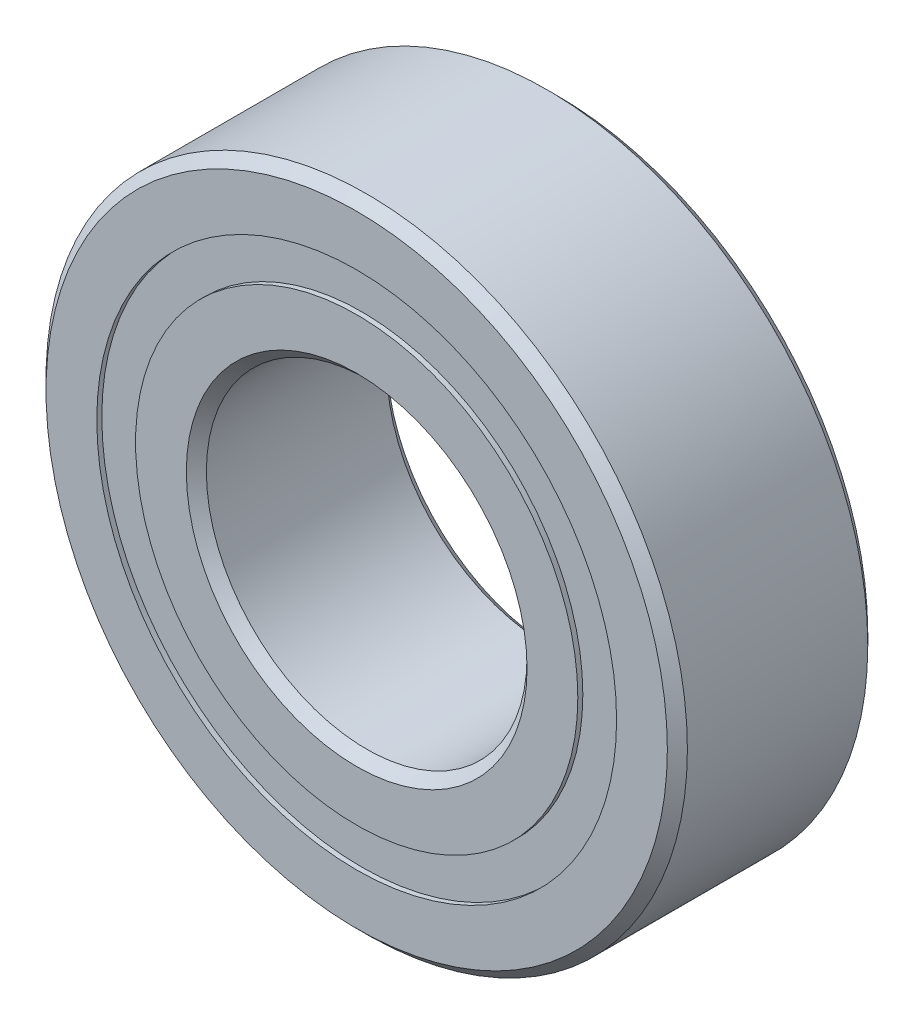
ISO-10303-21;
HEADER;
FILE_DESCRIPTION(('STEP AP214'),'2;1');
FILE_NAME('part.step','',(''),(''),'','','');
FILE_SCHEMA(('AUTOMOTIVE_DESIGN { 1 0 10303 214 1 1 1 1 }'));
ENDSEC;
DATA;
#1=APPLICATION_CONTEXT('core data for automotive mechanical design processes');
#2=APPLICATION_PROTOCOL_DEFINITION('international standard','automotive_design',2000,#1);
#3=PRODUCT_CONTEXT('',#1,'mechanical');
#4=PRODUCT('Part','Part','',(#3));
#5=PRODUCT_RELATED_PRODUCT_CATEGORY('part','',(#4));
#6=PRODUCT_DEFINITION_FORMATION('','',#4);
#7=PRODUCT_DEFINITION_CONTEXT('part definition',#1,'design');
#8=PRODUCT_DEFINITION('design','',#6,#7);
#9=PRODUCT_DEFINITION_SHAPE('','',#8);
#10=(LENGTH_UNIT() NAMED_UNIT(*) SI_UNIT(.MILLI.,.METRE.));
#11=(NAMED_UNIT(*) PLANE_ANGLE_UNIT() SI_UNIT($,.RADIAN.));
#12=(NAMED_UNIT(*) SI_UNIT($,.STERADIAN.) SOLID_ANGLE_UNIT());
#13=UNCERTAINTY_MEASURE_WITH_UNIT(LENGTH_MEASURE(1.E-05),#10,'distance_accuracy_value','');
#14=(GEOMETRIC_REPRESENTATION_CONTEXT(3) GLOBAL_UNCERTAINTY_ASSIGNED_CONTEXT((#13)) GLOBAL_UNIT_ASSIGNED_CONTEXT((#10,
#11,#12)) REPRESENTATION_CONTEXT('',''));
#15=CARTESIAN_POINT('',(0.,0.,0.));
#16=DIRECTION('',(0.,0.,1.));
#17=DIRECTION('',(1.,0.,0.));
#18=AXIS2_PLACEMENT_3D('',#15,#16,#17);
#19=CARTESIAN_POINT('',(0.,6.48351648351648,-2.375));
#20=DIRECTION('',(0.,0.,1.));
#21=DIRECTION('',(1.,0.,0.));
#22=AXIS2_PLACEMENT_3D('',#19,#20,#21);
#23=PLANE('',#22);
#24=CARTESIAN_POINT('',(0.,0.,-2.375));
#25=DIRECTION('',(0.,0.,1.));
#26=DIRECTION('',(1.,0.,0.));
#27=AXIS2_PLACEMENT_3D('',#24,#25,#26);
#28=CIRCLE('',#27,6.48351648351648);
#29=CARTESIAN_POINT('',(6.48351648351648,0.,-2.375));
#30=VERTEX_POINT('',#29);
#31=EDGE_CURVE('E64',#30,#30,#28,.T.);
#32=ORIENTED_EDGE('',*,*,#31,.F.);
#33=EDGE_LOOP('',(#32));
#34=FACE_BOUND('',#33,.T.);
#35=CARTESIAN_POINT('',(0.,0.,-2.375));
#36=DIRECTION('',(0.,0.,1.));
#37=DIRECTION('',(1.,0.,0.));
#38=AXIS2_PLACEMENT_3D('',#35,#36,#37);
#39=CIRCLE('',#38,5.51648351648352);
#40=CARTESIAN_POINT('',(5.51648351648352,0.,-2.375));
#41=VERTEX_POINT('',#40);
#42=EDGE_CURVE('E11',#41,#41,#39,.T.);
#43=ORIENTED_EDGE('',*,*,#42,.T.);
#44=EDGE_LOOP('',(#43));
#45=FACE_BOUND('',#44,.T.);
#46=ADVANCED_FACE('F50',(#34,#45),#23,.F.);
#47=CARTESIAN_POINT('',(0.,0.,2.5));
#48=DIRECTION('',(0.,0.,1.));
#49=DIRECTION('',(1.,0.,0.));
#50=AXIS2_PLACEMENT_3D('',#47,#48,#49);
#51=CYLINDRICAL_SURFACE('',#50,5.51648351648352);
#52=ORIENTED_EDGE('',*,*,#42,.F.);
#53=EDGE_LOOP('',(#52));
#54=FACE_BOUND('',#53,.T.);
#55=CARTESIAN_POINT('',(0.,0.,-1.21175743903915));
#56=DIRECTION('',(0.,0.,1.));
#57=DIRECTION('',(1.,0.,0.));
#58=AXIS2_PLACEMENT_3D('',#55,#56,#57);
#59=CIRCLE('',#58,5.51648351648352);
#60=CARTESIAN_POINT('',(5.51648351648352,0.,-1.21175743903915));
#61=VERTEX_POINT('',#60);
#62=EDGE_CURVE('E56',#61,#61,#59,.T.);
#63=ORIENTED_EDGE('',*,*,#62,.T.);
#64=EDGE_LOOP('',(#63));
#65=FACE_BOUND('',#64,.T.);
#66=ADVANCED_FACE('F73',(#54,#65),#51,.F.);
#67=CARTESIAN_POINT('',(0.,6.48351648351648,-1.21175743903915));
#68=DIRECTION('',(0.,0.,-1.));
#69=DIRECTION('',(-1.,0.,0.));
#70=AXIS2_PLACEMENT_3D('',#67,#68,#69);
#71=PLANE('',#70);
#72=ORIENTED_EDGE('',*,*,#62,.F.);
#73=EDGE_LOOP('',(#72));
#74=FACE_BOUND('',#73,.T.);
#75=CARTESIAN_POINT('',(0.,0.,-1.21175743903915));
#76=DIRECTION('',(0.,0.,1.));
#77=DIRECTION('',(1.,0.,0.));
#78=AXIS2_PLACEMENT_3D('',#75,#76,#77);
#79=CIRCLE('',#78,6.48351648351648);
#80=CARTESIAN_POINT('',(6.48351648351648,0.,-1.21175743903915));
#81=VERTEX_POINT('',#80);
#82=EDGE_CURVE('E60',#81,#81,#79,.T.);
#83=ORIENTED_EDGE('',*,*,#82,.T.);
#84=EDGE_LOOP('',(#83));
#85=FACE_BOUND('',#84,.T.);
#86=ADVANCED_FACE('F77',(#74,#85),#71,.F.);
#87=CARTESIAN_POINT('',(0.,0.,2.5));
#88=DIRECTION('',(0.,0.,1.));
#89=DIRECTION('',(1.,0.,0.));
#90=AXIS2_PLACEMENT_3D('',#87,#88,#89);
#91=CYLINDRICAL_SURFACE('',#90,6.48351648351648);
#92=ORIENTED_EDGE('',*,*,#82,.F.);
#93=EDGE_LOOP('',(#92));
#94=FACE_BOUND('',#93,.T.);
#95=ORIENTED_EDGE('',*,*,#31,.T.);
#96=EDGE_LOOP('',(#95));
#97=FACE_BOUND('',#96,.T.);
#98=ADVANCED_FACE('F70',(#94,#97),#91,.T.);
#99=CLOSED_SHELL('',(#46,#66,#86,#98));
#100=MANIFOLD_SOLID_BREP('B2',#99);
#101=CARTESIAN_POINT('',(0.,6.48351648351648,2.375));
#102=DIRECTION('',(0.,0.,-1.));
#103=DIRECTION('',(-1.,0.,0.));
#104=AXIS2_PLACEMENT_3D('',#101,#102,#103);
#105=PLANE('',#104);
#106=CARTESIAN_POINT('',(0.,0.,2.375));
#107=DIRECTION('',(0.,0.,1.));
#108=DIRECTION('',(1.,0.,0.));
#109=AXIS2_PLACEMENT_3D('',#106,#107,#108);
#110=CIRCLE('',#109,5.51648351648352);
#111=CARTESIAN_POINT('',(5.51648351648352,0.,2.375));
#112=VERTEX_POINT('',#111);
#113=EDGE_CURVE('E49',#112,#112,#110,.T.);
#114=ORIENTED_EDGE('',*,*,#113,.F.);
#115=EDGE_LOOP('',(#114));
#116=FACE_BOUND('',#115,.T.);
#117=CARTESIAN_POINT('',(0.,0.,2.375));
#118=DIRECTION('',(0.,0.,1.));
#119=DIRECTION('',(1.,0.,0.));
#120=AXIS2_PLACEMENT_3D('',#117,#118,#119);
#121=CIRCLE('',#120,6.48351648351648);
#122=CARTESIAN_POINT('',(6.48351648351648,0.,2.375));
#123=VERTEX_POINT('',#122);
#124=EDGE_CURVE('E124',#123,#123,#121,.T.);
#125=ORIENTED_EDGE('',*,*,#124,.T.);
#126=EDGE_LOOP('',(#125));
#127=FACE_BOUND('',#126,.T.);
#128=ADVANCED_FACE('F110',(#116,#127),#105,.F.);
#129=CARTESIAN_POINT('',(0.,0.,2.5));
#130=DIRECTION('',(0.,0.,1.));
#131=DIRECTION('',(1.,0.,0.));
#132=AXIS2_PLACEMENT_3D('',#129,#130,#131);
#133=CYLINDRICAL_SURFACE('',#132,5.51648351648352);
#134=CARTESIAN_POINT('',(0.,0.,1.21175743903915));
#135=DIRECTION('',(0.,0.,1.));
#136=DIRECTION('',(1.,0.,0.));
#137=AXIS2_PLACEMENT_3D('',#134,#135,#136);
#138=CIRCLE('',#137,5.51648351648352);
#139=CARTESIAN_POINT('',(5.51648351648352,0.,1.21175743903915));
#140=VERTEX_POINT('',#139);
#141=EDGE_CURVE('E116',#140,#140,#138,.T.);
#142=ORIENTED_EDGE('',*,*,#141,.F.);
#143=EDGE_LOOP('',(#142));
#144=FACE_BOUND('',#143,.T.);
#145=ORIENTED_EDGE('',*,*,#113,.T.);
#146=EDGE_LOOP('',(#145));
#147=FACE_BOUND('',#146,.T.);
#148=ADVANCED_FACE('F139',(#144,#147),#133,.F.);
#149=CARTESIAN_POINT('',(0.,6.48351648351648,1.21175743903915));
#150=DIRECTION('',(0.,0.,1.));
#151=DIRECTION('',(1.,0.,0.));
#152=AXIS2_PLACEMENT_3D('',#149,#150,#151);
#153=PLANE('',#152);
#154=CARTESIAN_POINT('',(0.,0.,1.21175743903915));
#155=DIRECTION('',(0.,0.,1.));
#156=DIRECTION('',(1.,0.,0.));
#157=AXIS2_PLACEMENT_3D('',#154,#155,#156);
#158=CIRCLE('',#157,6.48351648351648);
#159=CARTESIAN_POINT('',(6.48351648351648,0.,1.21175743903915));
#160=VERTEX_POINT('',#159);
#161=EDGE_CURVE('E120',#160,#160,#158,.T.);
#162=ORIENTED_EDGE('',*,*,#161,.F.);
#163=EDGE_LOOP('',(#162));
#164=FACE_BOUND('',#163,.T.);
#165=ORIENTED_EDGE('',*,*,#141,.T.);
#166=EDGE_LOOP('',(#165));
#167=FACE_BOUND('',#166,.T.);
#168=ADVANCED_FACE('F134',(#164,#167),#153,.F.);
#169=CARTESIAN_POINT('',(0.,0.,2.5));
#170=DIRECTION('',(0.,0.,1.));
#171=DIRECTION('',(1.,0.,0.));
#172=AXIS2_PLACEMENT_3D('',#169,#170,#171);
#173=CYLINDRICAL_SURFACE('',#172,6.48351648351648);
#174=ORIENTED_EDGE('',*,*,#124,.F.);
#175=EDGE_LOOP('',(#174));
#176=FACE_BOUND('',#175,.T.);
#177=ORIENTED_EDGE('',*,*,#161,.T.);
#178=EDGE_LOOP('',(#177));
#179=FACE_BOUND('',#178,.T.);
#180=ADVANCED_FACE('F131',(#176,#179),#173,.T.);
#181=CLOSED_SHELL('',(#128,#148,#168,#180));
#182=MANIFOLD_SOLID_BREP('B6',#181);
#183=CARTESIAN_POINT('',(-2.99999999999993,5.19615242270667,0.));
#184=DIRECTION('',(0.,0.,1.));
#185=DIRECTION('',(-0.499999999999989,0.866025403784445,0.));
#186=AXIS2_PLACEMENT_3D('',#183,#184,#185);
#187=SPHERICAL_SURFACE('',#186,1.21175743903915);
#188=CARTESIAN_POINT('',(-2.99999999999993,5.19615242270667,1.21175743903915));
#189=VERTEX_POINT('',#188);
#190=VERTEX_LOOP('',#189);
#191=FACE_BOUND('',#190,.T.);
#192=ADVANCED_FACE('F170',(#191),#187,.T.);
#193=CLOSED_SHELL('',(#192));
#194=MANIFOLD_SOLID_BREP('B44',#193);
#195=CARTESIAN_POINT('',(-5.1961524227066,3.00000000000006,0.));
#196=DIRECTION('',(0.,0.,1.));
#197=DIRECTION('',(-0.866025403784433,0.50000000000001,0.));
#198=AXIS2_PLACEMENT_3D('',#195,#196,#197);
#199=SPHERICAL_SURFACE('',#198,1.21175743903915);
#200=CARTESIAN_POINT('',(-5.1961524227066,3.00000000000006,1.21175743903915));
#201=VERTEX_POINT('',#200);
#202=VERTEX_LOOP('',#201);
#203=FACE_BOUND('',#202,.T.);
#204=ADVANCED_FACE('F193',(#203),#199,.T.);
#205=CLOSED_SHELL('',(#204));
#206=MANIFOLD_SOLID_BREP('B106',#205);
#207=CARTESIAN_POINT('',(-6.,0.,0.));
#208=DIRECTION('',(0.,0.,1.));
#209=DIRECTION('',(-1.,0.,0.));
#210=AXIS2_PLACEMENT_3D('',#207,#208,#209);
#211=SPHERICAL_SURFACE('',#210,1.21175743903915);
#212=CARTESIAN_POINT('',(-6.,0.,1.21175743903915));
#213=VERTEX_POINT('',#212);
#214=VERTEX_LOOP('',#213);
#215=FACE_BOUND('',#214,.T.);
#216=ADVANCED_FACE('F216',(#215),#211,.T.);
#217=CLOSED_SHELL('',(#216));
#218=MANIFOLD_SOLID_BREP('B166',#217);
#219=CARTESIAN_POINT('',(-5.19615242270666,-2.99999999999995,0.));
#220=DIRECTION('',(0.,0.,1.));
#221=DIRECTION('',(-0.866025403784443,-0.499999999999992,0.));
#222=AXIS2_PLACEMENT_3D('',#219,#220,#221);
#223=SPHERICAL_SURFACE('',#222,1.21175743903915);
#224=CARTESIAN_POINT('',(-5.19615242270666,-2.99999999999995,1.21175743903915));
#225=VERTEX_POINT('',#224);
#226=VERTEX_LOOP('',#225);
#227=FACE_BOUND('',#226,.T.);
#228=ADVANCED_FACE('F239',(#227),#223,.T.);
#229=CLOSED_SHELL('',(#228));
#230=MANIFOLD_SOLID_BREP('B189',#229);
#231=CARTESIAN_POINT('',(-3.00000000000004,-5.19615242270661,0.));
#232=DIRECTION('',(0.,0.,1.));
#233=DIRECTION('',(-0.500000000000007,-0.866025403784435,0.));
#234=AXIS2_PLACEMENT_3D('',#231,#232,#233);
#235=SPHERICAL_SURFACE('',#234,1.21175743903915);
#236=CARTESIAN_POINT('',(-3.00000000000004,-5.19615242270661,1.21175743903915));
#237=VERTEX_POINT('',#236);
#238=VERTEX_LOOP('',#237);
#239=FACE_BOUND('',#238,.T.);
#240=ADVANCED_FACE('F262',(#239),#235,.T.);
#241=CLOSED_SHELL('',(#240));
#242=MANIFOLD_SOLID_BREP('B212',#241);
#243=CARTESIAN_POINT('',(0.,-6.,0.));
#244=DIRECTION('',(0.,0.,1.));
#245=DIRECTION('',(0.,-1.,0.));
#246=AXIS2_PLACEMENT_3D('',#243,#244,#245);
#247=SPHERICAL_SURFACE('',#246,1.21175743903915);
#248=CARTESIAN_POINT('',(0.,-6.,1.21175743903915));
#249=VERTEX_POINT('',#248);
#250=VERTEX_LOOP('',#249);
#251=FACE_BOUND('',#250,.T.);
#252=ADVANCED_FACE('F285',(#251),#247,.T.);
#253=CLOSED_SHELL('',(#252));
#254=MANIFOLD_SOLID_BREP('B235',#253);
#255=CARTESIAN_POINT('',(2.99999999999997,-5.19615242270665,0.));
#256=DIRECTION('',(0.,0.,1.));
#257=DIRECTION('',(0.499999999999995,-0.866025403784442,0.));
#258=AXIS2_PLACEMENT_3D('',#255,#256,#257);
#259=SPHERICAL_SURFACE('',#258,1.21175743903915);
#260=CARTESIAN_POINT('',(2.99999999999997,-5.19615242270665,1.21175743903915));
#261=VERTEX_POINT('',#260);
#262=VERTEX_LOOP('',#261);
#263=FACE_BOUND('',#262,.T.);
#264=ADVANCED_FACE('F308',(#263),#259,.T.);
#265=CLOSED_SHELL('',(#264));
#266=MANIFOLD_SOLID_BREP('B258',#265);
#267=CARTESIAN_POINT('',(5.19615242270662,-3.00000000000002,0.));
#268=DIRECTION('',(0.,0.,1.));
#269=DIRECTION('',(0.866025403784436,-0.500000000000004,0.));
#270=AXIS2_PLACEMENT_3D('',#267,#268,#269);
#271=SPHERICAL_SURFACE('',#270,1.21175743903915);
#272=CARTESIAN_POINT('',(5.19615242270662,-3.00000000000002,1.21175743903915));
#273=VERTEX_POINT('',#272);
#274=VERTEX_LOOP('',#273);
#275=FACE_BOUND('',#274,.T.);
#276=ADVANCED_FACE('F331',(#275),#271,.T.);
#277=CLOSED_SHELL('',(#276));
#278=MANIFOLD_SOLID_BREP('B281',#277);
#279=CARTESIAN_POINT('',(6.,0.,0.));
#280=DIRECTION('',(0.,0.,1.));
#281=DIRECTION('',(1.,0.,0.));
#282=AXIS2_PLACEMENT_3D('',#279,#280,#281);
#283=SPHERICAL_SURFACE('',#282,1.21175743903915);
#284=CARTESIAN_POINT('',(6.,0.,1.21175743903915));
#285=VERTEX_POINT('',#284);
#286=VERTEX_LOOP('',#285);
#287=FACE_BOUND('',#286,.T.);
#288=ADVANCED_FACE('F354',(#287),#283,.T.);
#289=CLOSED_SHELL('',(#288));
#290=MANIFOLD_SOLID_BREP('B304',#289);
#291=CARTESIAN_POINT('',(5.19615242270664,2.99999999999999,0.));
#292=DIRECTION('',(0.,0.,1.));
#293=DIRECTION('',(0.86602540378444,0.499999999999998,0.));
#294=AXIS2_PLACEMENT_3D('',#291,#292,#293);
#295=SPHERICAL_SURFACE('',#294,1.21175743903915);
#296=CARTESIAN_POINT('',(5.19615242270664,2.99999999999999,1.21175743903915));
#297=VERTEX_POINT('',#296);
#298=VERTEX_LOOP('',#297);
#299=FACE_BOUND('',#298,.T.);
#300=ADVANCED_FACE('F377',(#299),#295,.T.);
#301=CLOSED_SHELL('',(#300));
#302=MANIFOLD_SOLID_BREP('B327',#301);
#303=CARTESIAN_POINT('',(3.00000000000001,5.19615242270663,0.));
#304=DIRECTION('',(0.,0.,1.));
#305=DIRECTION('',(0.500000000000001,0.866025403784438,0.));
#306=AXIS2_PLACEMENT_3D('',#303,#304,#305);
#307=SPHERICAL_SURFACE('',#306,1.21175743903915);
#308=CARTESIAN_POINT('',(3.00000000000001,5.19615242270663,1.21175743903915));
#309=VERTEX_POINT('',#308);
#310=VERTEX_LOOP('',#309);
#311=FACE_BOUND('',#310,.T.);
#312=ADVANCED_FACE('F400',(#311),#307,.T.);
#313=CLOSED_SHELL('',(#312));
#314=MANIFOLD_SOLID_BREP('B350',#313);
#315=CARTESIAN_POINT('',(0.,6.,0.));
#316=DIRECTION('',(0.,0.,1.));
#317=DIRECTION('',(0.,1.,0.));
#318=AXIS2_PLACEMENT_3D('',#315,#316,#317);
#319=SPHERICAL_SURFACE('',#318,1.21175743903915);
#320=CARTESIAN_POINT('',(0.,6.,1.21175743903915));
#321=VERTEX_POINT('',#320);
#322=VERTEX_LOOP('',#321);
#323=FACE_BOUND('',#322,.T.);
#324=ADVANCED_FACE('F425',(#323),#319,.T.);
#325=CLOSED_SHELL('',(#324));
#326=MANIFOLD_SOLID_BREP('B373',#325);
#327=CARTESIAN_POINT('',(0.,5.51648351648352,2.5));
#328=DIRECTION('',(0.,0.,-1.));
#329=DIRECTION('',(-1.,0.,0.));
#330=AXIS2_PLACEMENT_3D('',#327,#328,#329);
#331=PLANE('',#330);
#332=CARTESIAN_POINT('',(0.,0.,2.5));
#333=DIRECTION('',(0.,0.,1.));
#334=DIRECTION('',(1.,0.,0.));
#335=AXIS2_PLACEMENT_3D('',#332,#333,#334);
#336=CIRCLE('',#335,4.25);
#337=CARTESIAN_POINT('',(4.25,0.,2.5));
#338=VERTEX_POINT('',#337);
#339=EDGE_CURVE('E471',#338,#338,#336,.T.);
#340=ORIENTED_EDGE('',*,*,#339,.F.);
#341=EDGE_LOOP('',(#340));
#342=FACE_BOUND('',#341,.T.);
#343=CARTESIAN_POINT('',(0.,0.,2.5));
#344=DIRECTION('',(0.,0.,1.));
#345=DIRECTION('',(1.,0.,0.));
#346=AXIS2_PLACEMENT_3D('',#343,#344,#345);
#347=CIRCLE('',#346,5.51648351648352);
#348=CARTESIAN_POINT('',(5.51648351648352,0.,2.5));
#349=VERTEX_POINT('',#348);
#350=EDGE_CURVE('E424',#349,#349,#347,.T.);
#351=ORIENTED_EDGE('',*,*,#350,.T.);
#352=EDGE_LOOP('',(#351));
#353=FACE_BOUND('',#352,.T.);
#354=ADVANCED_FACE('F443',(#342,#353),#331,.F.);
#355=CARTESIAN_POINT('',(0.,0.,2.5));
#356=DIRECTION('',(0.,0.,1.));
#357=DIRECTION('',(1.,0.,0.));
#358=AXIS2_PLACEMENT_3D('',#355,#356,#357);
#359=CYLINDRICAL_SURFACE('',#358,5.51648351648352);
#360=ORIENTED_EDGE('',*,*,#350,.F.);
#361=EDGE_LOOP('',(#360));
#362=FACE_BOUND('',#361,.T.);
#363=CARTESIAN_POINT('',(0.,0.,1.11111111111111));
#364=DIRECTION('',(0.,0.,1.));
#365=DIRECTION('',(1.,0.,0.));
#366=AXIS2_PLACEMENT_3D('',#363,#364,#365);
#367=CIRCLE('',#366,5.51648351648352);
#368=CARTESIAN_POINT('',(5.51648351648352,0.,1.11111111111111));
#369=VERTEX_POINT('',#368);
#370=EDGE_CURVE('E449',#369,#369,#367,.T.);
#371=ORIENTED_EDGE('',*,*,#370,.T.);
#372=EDGE_LOOP('',(#371));
#373=FACE_BOUND('',#372,.T.);
#374=ADVANCED_FACE('F478',(#362,#373),#359,.T.);
#375=CARTESIAN_POINT('',(0.,0.,0.));
#376=DIRECTION('',(0.,0.,1.));
#377=DIRECTION('',(1.,0.,0.));
#378=AXIS2_PLACEMENT_3D('',#375,#376,#377);
#379=TOROIDAL_SURFACE('',#378,6.,1.21175743903915);
#380=ORIENTED_EDGE('',*,*,#370,.F.);
#381=EDGE_LOOP('',(#380));
#382=FACE_BOUND('',#381,.T.);
#383=CARTESIAN_POINT('',(0.,0.,-1.11111111111111));
#384=DIRECTION('',(0.,0.,1.));
#385=DIRECTION('',(1.,0.,0.));
#386=AXIS2_PLACEMENT_3D('',#383,#384,#385);
#387=CIRCLE('',#386,5.51648351648352);
#388=CARTESIAN_POINT('',(5.51648351648352,0.,-1.11111111111111));
#389=VERTEX_POINT('',#388);
#390=EDGE_CURVE('E453',#389,#389,#387,.T.);
#391=ORIENTED_EDGE('',*,*,#390,.T.);
#392=EDGE_LOOP('',(#391));
#393=FACE_BOUND('',#392,.T.);
#394=ADVANCED_FACE('F482',(#382,#393),#379,.F.);
#395=CARTESIAN_POINT('',(0.,0.,2.5));
#396=DIRECTION('',(0.,0.,1.));
#397=DIRECTION('',(1.,0.,0.));
#398=AXIS2_PLACEMENT_3D('',#395,#396,#397);
#399=CYLINDRICAL_SURFACE('',#398,5.51648351648352);
#400=ORIENTED_EDGE('',*,*,#390,.F.);
#401=EDGE_LOOP('',(#400));
#402=FACE_BOUND('',#401,.T.);
#403=CARTESIAN_POINT('',(0.,0.,-2.5));
#404=DIRECTION('',(0.,0.,1.));
#405=DIRECTION('',(1.,0.,0.));
#406=AXIS2_PLACEMENT_3D('',#403,#404,#405);
#407=CIRCLE('',#406,5.51648351648352);
#408=CARTESIAN_POINT('',(5.51648351648352,0.,-2.5));
#409=VERTEX_POINT('',#408);
#410=EDGE_CURVE('E457',#409,#409,#407,.T.);
#411=ORIENTED_EDGE('',*,*,#410,.T.);
#412=EDGE_LOOP('',(#411));
#413=FACE_BOUND('',#412,.T.);
#414=ADVANCED_FACE('F487',(#402,#413),#399,.T.);
#415=CARTESIAN_POINT('',(0.,4.25,-2.5));
#416=DIRECTION('',(0.,0.,1.));
#417=DIRECTION('',(1.,0.,0.));
#418=AXIS2_PLACEMENT_3D('',#415,#416,#417);
#419=PLANE('',#418);
#420=ORIENTED_EDGE('',*,*,#410,.F.);
#421=EDGE_LOOP('',(#420));
#422=FACE_BOUND('',#421,.T.);
#423=CARTESIAN_POINT('',(0.,0.,-2.5));
#424=DIRECTION('',(0.,0.,1.));
#425=DIRECTION('',(1.,0.,0.));
#426=AXIS2_PLACEMENT_3D('',#423,#424,#425);
#427=CIRCLE('',#426,4.25);
#428=CARTESIAN_POINT('',(4.25,0.,-2.5));
#429=VERTEX_POINT('',#428);
#430=EDGE_CURVE('E462',#429,#429,#427,.T.);
#431=ORIENTED_EDGE('',*,*,#430,.T.);
#432=EDGE_LOOP('',(#431));
#433=FACE_BOUND('',#432,.T.);
#434=ADVANCED_FACE('F493',(#422,#433),#419,.F.);
#435=CARTESIAN_POINT('',(0.,0.,-2.25));
#436=DIRECTION('',(0.,0.,-1.));
#437=DIRECTION('',(-1.,0.,0.));
#438=AXIS2_PLACEMENT_3D('',#435,#436,#437);
#439=CONICAL_SURFACE('',#438,4.,0.785398163397447);
#440=ORIENTED_EDGE('',*,*,#430,.F.);
#441=EDGE_LOOP('',(#440));
#442=FACE_BOUND('',#441,.T.);
#443=CARTESIAN_POINT('',(0.,0.,-2.25));
#444=DIRECTION('',(0.,0.,1.));
#445=DIRECTION('',(1.,0.,0.));
#446=AXIS2_PLACEMENT_3D('',#443,#444,#445);
#447=CIRCLE('',#446,4.);
#448=CARTESIAN_POINT('',(4.,0.,-2.25));
#449=VERTEX_POINT('',#448);
#450=EDGE_CURVE('E465',#449,#449,#447,.T.);
#451=ORIENTED_EDGE('',*,*,#450,.T.);
#452=EDGE_LOOP('',(#451));
#453=FACE_BOUND('',#452,.T.);
#454=ADVANCED_FACE('F497',(#442,#453),#439,.F.);
#455=CARTESIAN_POINT('',(0.,0.,2.5));
#456=DIRECTION('',(0.,0.,1.));
#457=DIRECTION('',(1.,0.,0.));
#458=AXIS2_PLACEMENT_3D('',#455,#456,#457);
#459=CYLINDRICAL_SURFACE('',#458,4.);
#460=ORIENTED_EDGE('',*,*,#450,.F.);
#461=EDGE_LOOP('',(#460));
#462=FACE_BOUND('',#461,.T.);
#463=CARTESIAN_POINT('',(0.,0.,2.25));
#464=DIRECTION('',(0.,0.,1.));
#465=DIRECTION('',(1.,0.,0.));
#466=AXIS2_PLACEMENT_3D('',#463,#464,#465);
#467=CIRCLE('',#466,4.);
#468=CARTESIAN_POINT('',(4.,0.,2.25));
#469=VERTEX_POINT('',#468);
#470=EDGE_CURVE('E468',#469,#469,#467,.T.);
#471=ORIENTED_EDGE('',*,*,#470,.T.);
#472=EDGE_LOOP('',(#471));
#473=FACE_BOUND('',#472,.T.);
#474=ADVANCED_FACE('F501',(#462,#473),#459,.F.);
#475=CARTESIAN_POINT('',(0.,0.,2.5));
#476=DIRECTION('',(0.,0.,1.));
#477=DIRECTION('',(1.,0.,0.));
#478=AXIS2_PLACEMENT_3D('',#475,#476,#477);
#479=CONICAL_SURFACE('',#478,4.25,0.785398163397452);
#480=ORIENTED_EDGE('',*,*,#470,.F.);
#481=EDGE_LOOP('',(#480));
#482=FACE_BOUND('',#481,.T.);
#483=ORIENTED_EDGE('',*,*,#339,.T.);
#484=EDGE_LOOP('',(#483));
#485=FACE_BOUND('',#484,.T.);
#486=ADVANCED_FACE('F475',(#482,#485),#479,.F.);
#487=CLOSED_SHELL('',(#354,#374,#394,#414,#434,#454,#474,#486));
#488=MANIFOLD_SOLID_BREP('B396',#487);
#489=CARTESIAN_POINT('',(0.,0.,2.25));
#490=DIRECTION('',(0.,0.,-1.));
#491=DIRECTION('',(-1.,0.,0.));
#492=AXIS2_PLACEMENT_3D('',#489,#490,#491);
#493=CONICAL_SURFACE('',#492,8.,0.785398163397448);
#494=CARTESIAN_POINT('',(0.,0.,2.5));
#495=DIRECTION('',(0.,0.,1.));
#496=DIRECTION('',(1.,0.,0.));
#497=AXIS2_PLACEMENT_3D('',#494,#495,#496);
#498=CIRCLE('',#497,7.75);
#499=CARTESIAN_POINT('',(7.75,0.,2.5));
#500=VERTEX_POINT('',#499);
#501=EDGE_CURVE('E577',#500,#500,#498,.T.);
#502=ORIENTED_EDGE('',*,*,#501,.F.);
#503=EDGE_LOOP('',(#502));
#504=FACE_BOUND('',#503,.T.);
#505=CARTESIAN_POINT('',(0.,0.,2.25));
#506=DIRECTION('',(0.,0.,1.));
#507=DIRECTION('',(1.,0.,0.));
#508=AXIS2_PLACEMENT_3D('',#505,#506,#507);
#509=CIRCLE('',#508,8.);
#510=CARTESIAN_POINT('',(8.,0.,2.25));
#511=VERTEX_POINT('',#510);
#512=EDGE_CURVE('E442',#511,#511,#509,.T.);
#513=ORIENTED_EDGE('',*,*,#512,.T.);
#514=EDGE_LOOP('',(#513));
#515=FACE_BOUND('',#514,.T.);
#516=ADVANCED_FACE('F549',(#504,#515),#493,.T.);
#517=CARTESIAN_POINT('',(0.,0.,2.5));
#518=DIRECTION('',(0.,0.,1.));
#519=DIRECTION('',(1.,0.,0.));
#520=AXIS2_PLACEMENT_3D('',#517,#518,#519);
#521=CYLINDRICAL_SURFACE('',#520,8.);
#522=ORIENTED_EDGE('',*,*,#512,.F.);
#523=EDGE_LOOP('',(#522));
#524=FACE_BOUND('',#523,.T.);
#525=CARTESIAN_POINT('',(0.,0.,-2.25));
#526=DIRECTION('',(0.,0.,1.));
#527=DIRECTION('',(1.,0.,0.));
#528=AXIS2_PLACEMENT_3D('',#525,#526,#527);
#529=CIRCLE('',#528,8.);
#530=CARTESIAN_POINT('',(8.,0.,-2.25));
#531=VERTEX_POINT('',#530);
#532=EDGE_CURVE('E555',#531,#531,#529,.T.);
#533=ORIENTED_EDGE('',*,*,#532,.T.);
#534=EDGE_LOOP('',(#533));
#535=FACE_BOUND('',#534,.T.);
#536=ADVANCED_FACE('F584',(#524,#535),#521,.T.);
#537=CARTESIAN_POINT('',(0.,0.,-2.5));
#538=DIRECTION('',(0.,0.,1.));
#539=DIRECTION('',(1.,0.,0.));
#540=AXIS2_PLACEMENT_3D('',#537,#538,#539);
#541=CONICAL_SURFACE('',#540,7.75,0.785398163397447);
#542=ORIENTED_EDGE('',*,*,#532,.F.);
#543=EDGE_LOOP('',(#542));
#544=FACE_BOUND('',#543,.T.);
#545=CARTESIAN_POINT('',(0.,0.,-2.5));
#546=DIRECTION('',(0.,0.,1.));
#547=DIRECTION('',(1.,0.,0.));
#548=AXIS2_PLACEMENT_3D('',#545,#546,#547);
#549=CIRCLE('',#548,7.75);
#550=CARTESIAN_POINT('',(7.75,0.,-2.5));
#551=VERTEX_POINT('',#550);
#552=EDGE_CURVE('E559',#551,#551,#549,.T.);
#553=ORIENTED_EDGE('',*,*,#552,.T.);
#554=EDGE_LOOP('',(#553));
#555=FACE_BOUND('',#554,.T.);
#556=ADVANCED_FACE('F588',(#544,#555),#541,.T.);
#557=CARTESIAN_POINT('',(0.,7.75,-2.5));
#558=DIRECTION('',(0.,0.,1.));
#559=DIRECTION('',(1.,0.,0.));
#560=AXIS2_PLACEMENT_3D('',#557,#558,#559);
#561=PLANE('',#560);
#562=ORIENTED_EDGE('',*,*,#552,.F.);
#563=EDGE_LOOP('',(#562));
#564=FACE_BOUND('',#563,.T.);
#565=CARTESIAN_POINT('',(0.,0.,-2.5));
#566=DIRECTION('',(0.,0.,1.));
#567=DIRECTION('',(1.,0.,0.));
#568=AXIS2_PLACEMENT_3D('',#565,#566,#567);
#569=CIRCLE('',#568,6.48351648351648);
#570=CARTESIAN_POINT('',(6.48351648351648,0.,-2.5));
#571=VERTEX_POINT('',#570);
#572=EDGE_CURVE('E563',#571,#571,#569,.T.);
#573=ORIENTED_EDGE('',*,*,#572,.T.);
#574=EDGE_LOOP('',(#573));
#575=FACE_BOUND('',#574,.T.);
#576=ADVANCED_FACE('F593',(#564,#575),#561,.F.);
#577=CARTESIAN_POINT('',(0.,0.,2.5));
#578=DIRECTION('',(0.,0.,1.));
#579=DIRECTION('',(1.,0.,0.));
#580=AXIS2_PLACEMENT_3D('',#577,#578,#579);
#581=CYLINDRICAL_SURFACE('',#580,6.48351648351648);
#582=ORIENTED_EDGE('',*,*,#572,.F.);
#583=EDGE_LOOP('',(#582));
#584=FACE_BOUND('',#583,.T.);
#585=CARTESIAN_POINT('',(0.,0.,-1.11111111111111));
#586=DIRECTION('',(0.,0.,1.));
#587=DIRECTION('',(1.,0.,0.));
#588=AXIS2_PLACEMENT_3D('',#585,#586,#587);
#589=CIRCLE('',#588,6.48351648351648);
#590=CARTESIAN_POINT('',(6.48351648351648,0.,-1.11111111111111));
#591=VERTEX_POINT('',#590);
#592=EDGE_CURVE('E568',#591,#591,#589,.T.);
#593=ORIENTED_EDGE('',*,*,#592,.T.);
#594=EDGE_LOOP('',(#593));
#595=FACE_BOUND('',#594,.T.);
#596=ADVANCED_FACE('F599',(#584,#595),#581,.F.);
#597=CARTESIAN_POINT('',(0.,0.,0.));
#598=DIRECTION('',(0.,0.,1.));
#599=DIRECTION('',(1.,0.,0.));
#600=AXIS2_PLACEMENT_3D('',#597,#598,#599);
#601=TOROIDAL_SURFACE('',#600,6.,1.21175743903915);
#602=ORIENTED_EDGE('',*,*,#592,.F.);
#603=EDGE_LOOP('',(#602));
#604=FACE_BOUND('',#603,.T.);
#605=CARTESIAN_POINT('',(0.,0.,1.11111111111111));
#606=DIRECTION('',(0.,0.,1.));
#607=DIRECTION('',(1.,0.,0.));
#608=AXIS2_PLACEMENT_3D('',#605,#606,#607);
#609=CIRCLE('',#608,6.48351648351648);
#610=CARTESIAN_POINT('',(6.48351648351648,0.,1.11111111111111));
#611=VERTEX_POINT('',#610);
#612=EDGE_CURVE('E571',#611,#611,#609,.T.);
#613=ORIENTED_EDGE('',*,*,#612,.T.);
#614=EDGE_LOOP('',(#613));
#615=FACE_BOUND('',#614,.T.);
#616=ADVANCED_FACE('F603',(#604,#615),#601,.F.);
#617=CARTESIAN_POINT('',(0.,0.,2.5));
#618=DIRECTION('',(0.,0.,1.));
#619=DIRECTION('',(1.,0.,0.));
#620=AXIS2_PLACEMENT_3D('',#617,#618,#619);
#621=CYLINDRICAL_SURFACE('',#620,6.48351648351648);
#622=ORIENTED_EDGE('',*,*,#612,.F.);
#623=EDGE_LOOP('',(#622));
#624=FACE_BOUND('',#623,.T.);
#625=CARTESIAN_POINT('',(0.,0.,2.5));
#626=DIRECTION('',(0.,0.,1.));
#627=DIRECTION('',(1.,0.,0.));
#628=AXIS2_PLACEMENT_3D('',#625,#626,#627);
#629=CIRCLE('',#628,6.48351648351648);
#630=CARTESIAN_POINT('',(6.48351648351648,0.,2.5));
#631=VERTEX_POINT('',#630);
#632=EDGE_CURVE('E574',#631,#631,#629,.T.);
#633=ORIENTED_EDGE('',*,*,#632,.T.);
#634=EDGE_LOOP('',(#633));
#635=FACE_BOUND('',#634,.T.);
#636=ADVANCED_FACE('F607',(#624,#635),#621,.F.);
#637=CARTESIAN_POINT('',(0.,7.75,2.5));
#638=DIRECTION('',(0.,0.,-1.));
#639=DIRECTION('',(-1.,0.,0.));
#640=AXIS2_PLACEMENT_3D('',#637,#638,#639);
#641=PLANE('',#640);
#642=ORIENTED_EDGE('',*,*,#632,.F.);
#643=EDGE_LOOP('',(#642));
#644=FACE_BOUND('',#643,.T.);
#645=ORIENTED_EDGE('',*,*,#501,.T.);
#646=EDGE_LOOP('',(#645));
#647=FACE_BOUND('',#646,.T.);
#648=ADVANCED_FACE('F581',(#644,#647),#641,.F.);
#649=CLOSED_SHELL('',(#516,#536,#556,#576,#596,#616,#636,#648));
#650=MANIFOLD_SOLID_BREP('B419',#649);
#651=ADVANCED_BREP_SHAPE_REPRESENTATION('',(#18,#100,#182,#194,#206,#218,#230,#242,#254,#266,
#278,#290,#302,#314,#326,#488,#650),#14);
#652=SHAPE_DEFINITION_REPRESENTATION(#9,#651);
ENDSEC;
END-ISO-10303-21;
